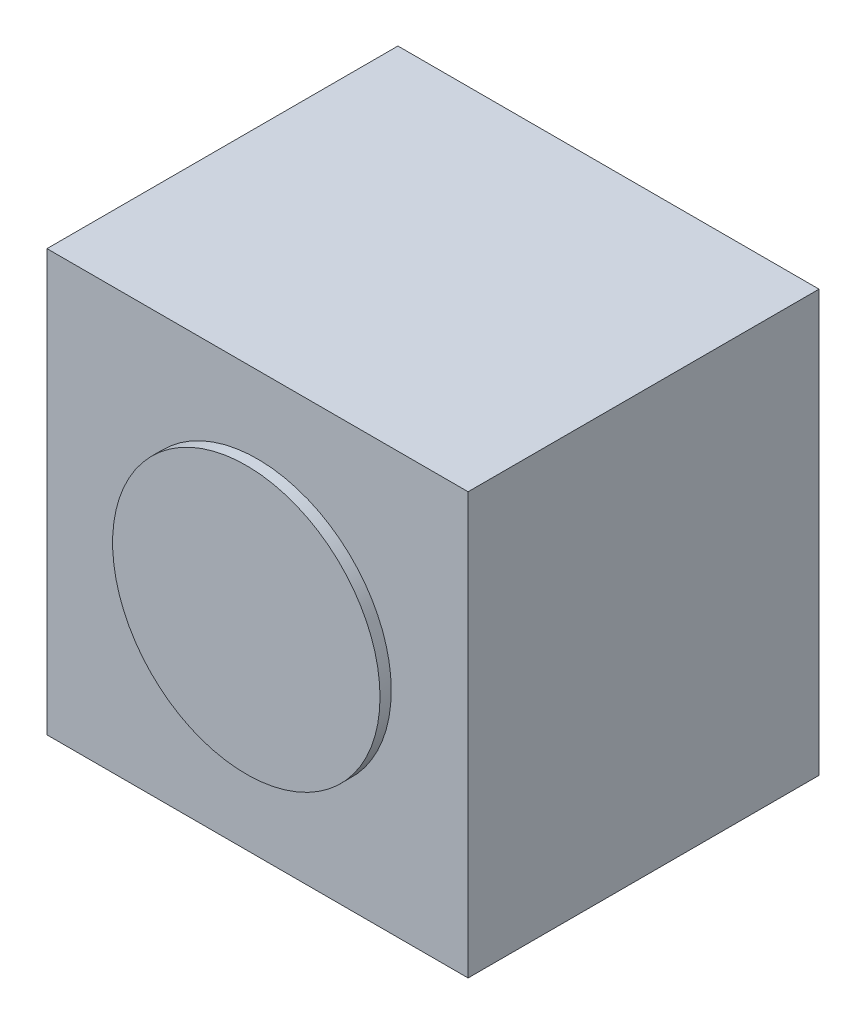
ISO-10303-21;
HEADER;
FILE_DESCRIPTION(('STEP AP214'),'2;1');
FILE_NAME('part.step','',(''),(''),'','','');
FILE_SCHEMA(('AUTOMOTIVE_DESIGN { 1 0 10303 214 1 1 1 1 }'));
ENDSEC;
DATA;
#1=APPLICATION_CONTEXT('core data for automotive mechanical design processes');
#2=APPLICATION_PROTOCOL_DEFINITION('international standard','automotive_design',2000,#1);
#3=PRODUCT_CONTEXT('',#1,'mechanical');
#4=PRODUCT('Part','Part','',(#3));
#5=PRODUCT_RELATED_PRODUCT_CATEGORY('part','',(#4));
#6=PRODUCT_DEFINITION_FORMATION('','',#4);
#7=PRODUCT_DEFINITION_CONTEXT('part definition',#1,'design');
#8=PRODUCT_DEFINITION('design','',#6,#7);
#9=PRODUCT_DEFINITION_SHAPE('','',#8);
#10=(LENGTH_UNIT() NAMED_UNIT(*) SI_UNIT(.MILLI.,.METRE.));
#11=(NAMED_UNIT(*) PLANE_ANGLE_UNIT() SI_UNIT($,.RADIAN.));
#12=(NAMED_UNIT(*) SI_UNIT($,.STERADIAN.) SOLID_ANGLE_UNIT());
#13=UNCERTAINTY_MEASURE_WITH_UNIT(LENGTH_MEASURE(1.E-05),#10,'distance_accuracy_value','');
#14=(GEOMETRIC_REPRESENTATION_CONTEXT(3) GLOBAL_UNCERTAINTY_ASSIGNED_CONTEXT((#13)) GLOBAL_UNIT_ASSIGNED_CONTEXT((#10,
#11,#12)) REPRESENTATION_CONTEXT('',''));
#15=CARTESIAN_POINT('',(0.,0.,0.));
#16=DIRECTION('',(0.,0.,1.));
#17=DIRECTION('',(1.,0.,0.));
#18=AXIS2_PLACEMENT_3D('',#15,#16,#17);
#19=CARTESIAN_POINT('',(30.,30.,50.));
#20=DIRECTION('',(-1.,0.,0.));
#21=DIRECTION('',(0.,-1.,0.));
#22=AXIS2_PLACEMENT_3D('',#19,#20,#21);
#23=PLANE('',#22);
#24=DIRECTION('',(0.,1.,0.));
#25=VECTOR('',#24,1.);
#26=CARTESIAN_POINT('',(30.,30.,0.));
#27=LINE('',#26,#25);
#28=CARTESIAN_POINT('',(30.,-30.,0.));
#29=VERTEX_POINT('',#28);
#30=CARTESIAN_POINT('',(30.,30.,0.));
#31=VERTEX_POINT('',#30);
#32=EDGE_CURVE('E114',#29,#31,#27,.T.);
#33=ORIENTED_EDGE('',*,*,#32,.T.);
#34=DIRECTION('',(0.,0.,-1.));
#35=VECTOR('',#34,1.);
#36=CARTESIAN_POINT('',(30.,30.,50.));
#37=LINE('',#36,#35);
#38=CARTESIAN_POINT('',(30.,30.,50.));
#39=VERTEX_POINT('',#38);
#40=EDGE_CURVE('E46',#39,#31,#37,.T.);
#41=ORIENTED_EDGE('',*,*,#40,.F.);
#42=DIRECTION('',(0.,1.,0.));
#43=VECTOR('',#42,1.);
#44=CARTESIAN_POINT('',(30.,30.,50.));
#45=LINE('',#44,#43);
#46=CARTESIAN_POINT('',(30.,-30.,50.));
#47=VERTEX_POINT('',#46);
#48=EDGE_CURVE('E97',#47,#39,#45,.T.);
#49=ORIENTED_EDGE('',*,*,#48,.F.);
#50=DIRECTION('',(0.,0.,-1.));
#51=VECTOR('',#50,1.);
#52=CARTESIAN_POINT('',(30.,-30.,50.));
#53=LINE('',#52,#51);
#54=EDGE_CURVE('E110',#47,#29,#53,.T.);
#55=ORIENTED_EDGE('',*,*,#54,.T.);
#56=EDGE_LOOP('',(#33,#41,#49,#55));
#57=FACE_BOUND('',#56,.T.);
#58=ADVANCED_FACE('F43',(#57),#23,.F.);
#59=CARTESIAN_POINT('',(-30.,30.,50.));
#60=DIRECTION('',(0.,-1.,0.));
#61=DIRECTION('',(0.,0.,-1.));
#62=AXIS2_PLACEMENT_3D('',#59,#60,#61);
#63=PLANE('',#62);
#64=DIRECTION('',(-1.,0.,0.));
#65=VECTOR('',#64,1.);
#66=CARTESIAN_POINT('',(-30.,30.,0.));
#67=LINE('',#66,#65);
#68=CARTESIAN_POINT('',(-30.,30.,0.));
#69=VERTEX_POINT('',#68);
#70=EDGE_CURVE('E103',#31,#69,#67,.T.);
#71=ORIENTED_EDGE('',*,*,#70,.T.);
#72=DIRECTION('',(0.,0.,-1.));
#73=VECTOR('',#72,1.);
#74=CARTESIAN_POINT('',(-30.,30.,50.));
#75=LINE('',#74,#73);
#76=CARTESIAN_POINT('',(-30.,30.,50.));
#77=VERTEX_POINT('',#76);
#78=EDGE_CURVE('E101',#77,#69,#75,.T.);
#79=ORIENTED_EDGE('',*,*,#78,.F.);
#80=DIRECTION('',(-1.,0.,0.));
#81=VECTOR('',#80,1.);
#82=CARTESIAN_POINT('',(-30.,30.,50.));
#83=LINE('',#82,#81);
#84=EDGE_CURVE('E92',#39,#77,#83,.T.);
#85=ORIENTED_EDGE('',*,*,#84,.F.);
#86=ORIENTED_EDGE('',*,*,#40,.T.);
#87=EDGE_LOOP('',(#71,#79,#85,#86));
#88=FACE_BOUND('',#87,.T.);
#89=ADVANCED_FACE('F102',(#88),#63,.F.);
#90=CARTESIAN_POINT('',(-30.,30.,50.));
#91=DIRECTION('',(1.,0.,0.));
#92=DIRECTION('',(0.,1.,0.));
#93=AXIS2_PLACEMENT_3D('',#90,#91,#92);
#94=PLANE('',#93);
#95=DIRECTION('',(0.,-1.,0.));
#96=VECTOR('',#95,1.);
#97=CARTESIAN_POINT('',(-30.,30.,0.));
#98=LINE('',#97,#96);
#99=CARTESIAN_POINT('',(-30.,-30.,0.));
#100=VERTEX_POINT('',#99);
#101=EDGE_CURVE('E78',#69,#100,#98,.T.);
#102=ORIENTED_EDGE('',*,*,#101,.T.);
#103=DIRECTION('',(0.,0.,-1.));
#104=VECTOR('',#103,1.);
#105=CARTESIAN_POINT('',(-30.,-30.,50.));
#106=LINE('',#105,#104);
#107=CARTESIAN_POINT('',(-30.,-30.,50.));
#108=VERTEX_POINT('',#107);
#109=EDGE_CURVE('E105',#108,#100,#106,.T.);
#110=ORIENTED_EDGE('',*,*,#109,.F.);
#111=DIRECTION('',(0.,-1.,0.));
#112=VECTOR('',#111,1.);
#113=CARTESIAN_POINT('',(-30.,30.,50.));
#114=LINE('',#113,#112);
#115=EDGE_CURVE('E95',#77,#108,#114,.T.);
#116=ORIENTED_EDGE('',*,*,#115,.F.);
#117=ORIENTED_EDGE('',*,*,#78,.T.);
#118=EDGE_LOOP('',(#102,#110,#116,#117));
#119=FACE_BOUND('',#118,.T.);
#120=ADVANCED_FACE('F106',(#119),#94,.F.);
#121=CARTESIAN_POINT('',(-30.,-30.,50.));
#122=DIRECTION('',(0.,1.,0.));
#123=DIRECTION('',(0.,0.,1.));
#124=AXIS2_PLACEMENT_3D('',#121,#122,#123);
#125=PLANE('',#124);
#126=DIRECTION('',(1.,0.,0.));
#127=VECTOR('',#126,1.);
#128=CARTESIAN_POINT('',(-30.,-30.,0.));
#129=LINE('',#128,#127);
#130=EDGE_CURVE('E84',#100,#29,#129,.T.);
#131=ORIENTED_EDGE('',*,*,#130,.T.);
#132=ORIENTED_EDGE('',*,*,#54,.F.);
#133=DIRECTION('',(1.,0.,0.));
#134=VECTOR('',#133,1.);
#135=CARTESIAN_POINT('',(-30.,-30.,50.));
#136=LINE('',#135,#134);
#137=EDGE_CURVE('E61',#108,#47,#136,.T.);
#138=ORIENTED_EDGE('',*,*,#137,.F.);
#139=ORIENTED_EDGE('',*,*,#109,.T.);
#140=EDGE_LOOP('',(#131,#132,#138,#139));
#141=FACE_BOUND('',#140,.T.);
#142=ADVANCED_FACE('F128',(#141),#125,.F.);
#143=CARTESIAN_POINT('',(0.,0.,50.));
#144=DIRECTION('',(0.,0.,1.));
#145=DIRECTION('',(1.,0.,0.));
#146=AXIS2_PLACEMENT_3D('',#143,#144,#145);
#147=PLANE('',#146);
#148=CARTESIAN_POINT('',(0.,0.,50.));
#149=DIRECTION('',(0.,0.,1.));
#150=DIRECTION('',(1.,0.,0.));
#151=AXIS2_PLACEMENT_3D('',#148,#149,#150);
#152=CIRCLE('',#151,19.05);
#153=CARTESIAN_POINT('',(19.05,0.,50.));
#154=VERTEX_POINT('',#153);
#155=EDGE_CURVE('E11',#154,#154,#152,.T.);
#156=ORIENTED_EDGE('',*,*,#155,.F.);
#157=EDGE_LOOP('',(#156));
#158=FACE_BOUND('',#157,.T.);
#159=ORIENTED_EDGE('',*,*,#48,.T.);
#160=ORIENTED_EDGE('',*,*,#84,.T.);
#161=ORIENTED_EDGE('',*,*,#115,.T.);
#162=ORIENTED_EDGE('',*,*,#137,.T.);
#163=EDGE_LOOP('',(#159,#160,#161,#162));
#164=FACE_BOUND('',#163,.T.);
#165=ADVANCED_FACE('F93',(#158,#164),#147,.T.);
#166=CARTESIAN_POINT('',(0.,0.,0.));
#167=DIRECTION('',(0.,0.,1.));
#168=DIRECTION('',(1.,0.,0.));
#169=AXIS2_PLACEMENT_3D('',#166,#167,#168);
#170=PLANE('',#169);
#171=ORIENTED_EDGE('',*,*,#32,.F.);
#172=ORIENTED_EDGE('',*,*,#130,.F.);
#173=ORIENTED_EDGE('',*,*,#101,.F.);
#174=ORIENTED_EDGE('',*,*,#70,.F.);
#175=EDGE_LOOP('',(#171,#172,#173,#174));
#176=FACE_BOUND('',#175,.T.);
#177=ADVANCED_FACE('F131',(#176),#170,.F.);
#178=CARTESIAN_POINT('',(0.,0.,51.6));
#179=DIRECTION('',(0.,0.,-1.));
#180=DIRECTION('',(-1.,0.,0.));
#181=AXIS2_PLACEMENT_3D('',#178,#179,#180);
#182=CYLINDRICAL_SURFACE('',#181,19.05);
#183=CARTESIAN_POINT('',(0.,0.,51.6));
#184=DIRECTION('',(0.,0.,1.));
#185=DIRECTION('',(1.,0.,0.));
#186=AXIS2_PLACEMENT_3D('',#183,#184,#185);
#187=CIRCLE('',#186,19.05);
#188=CARTESIAN_POINT('',(19.05,0.,51.6));
#189=VERTEX_POINT('',#188);
#190=EDGE_CURVE('E118',#189,#189,#187,.T.);
#191=ORIENTED_EDGE('',*,*,#190,.F.);
#192=EDGE_LOOP('',(#191));
#193=FACE_BOUND('',#192,.T.);
#194=ORIENTED_EDGE('',*,*,#155,.T.);
#195=EDGE_LOOP('',(#194));
#196=FACE_BOUND('',#195,.T.);
#197=ADVANCED_FACE('F141',(#193,#196),#182,.T.);
#198=CARTESIAN_POINT('',(0.,0.,51.6));
#199=DIRECTION('',(0.,0.,1.));
#200=DIRECTION('',(1.,0.,0.));
#201=AXIS2_PLACEMENT_3D('',#198,#199,#200);
#202=PLANE('',#201);
#203=ORIENTED_EDGE('',*,*,#190,.T.);
#204=EDGE_LOOP('',(#203));
#205=FACE_BOUND('',#204,.T.);
#206=ADVANCED_FACE('F139',(#205),#202,.T.);
#207=CLOSED_SHELL('',(#58,#89,#120,#142,#165,#177,#197,#206));
#208=MANIFOLD_SOLID_BREP('B2',#207);
#209=ADVANCED_BREP_SHAPE_REPRESENTATION('',(#18,#208),#14);
#210=SHAPE_DEFINITION_REPRESENTATION(#9,#209);
ENDSEC;
END-ISO-10303-21;
